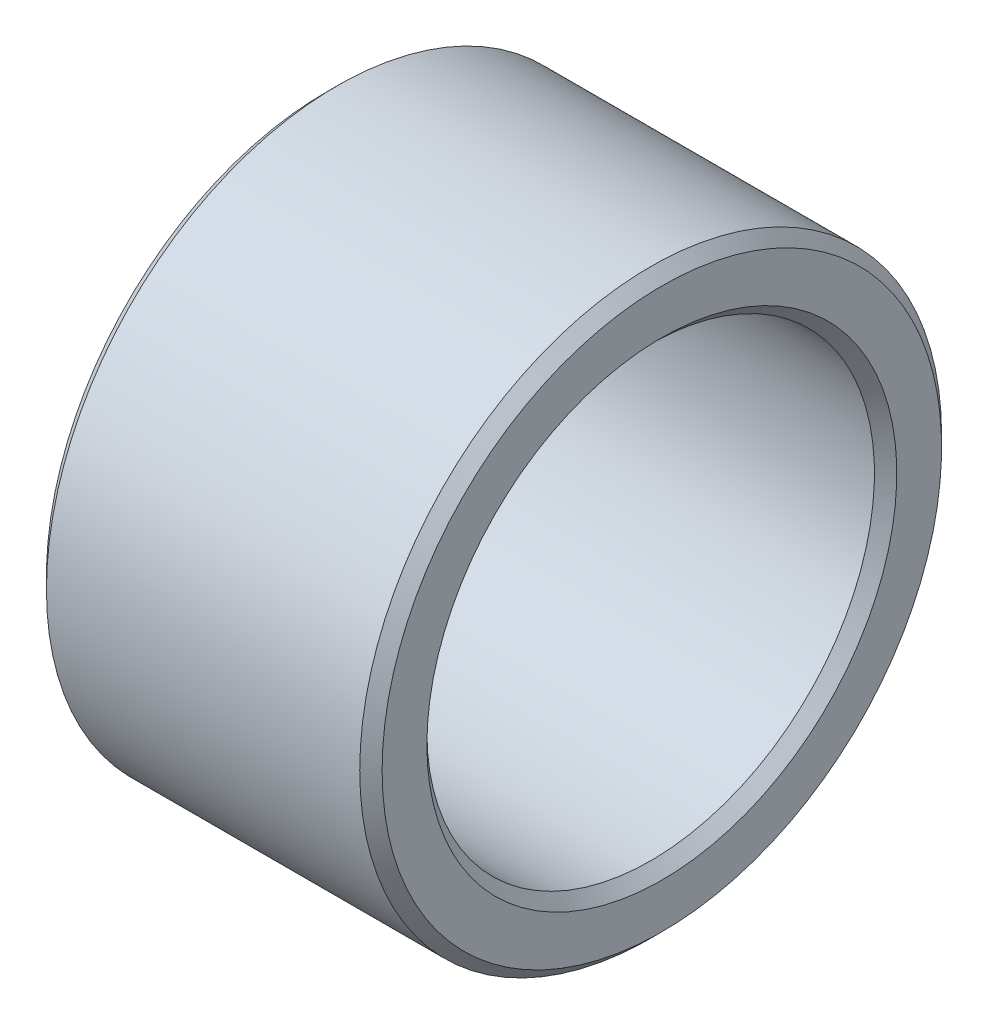
ISO-10303-21;
HEADER;
FILE_DESCRIPTION(('STEP AP214'),'2;1');
FILE_NAME('part.step','',(''),(''),'','','');
FILE_SCHEMA(('AUTOMOTIVE_DESIGN { 1 0 10303 214 1 1 1 1 }'));
ENDSEC;
DATA;
#1=APPLICATION_CONTEXT('core data for automotive mechanical design processes');
#2=APPLICATION_PROTOCOL_DEFINITION('international standard','automotive_design',2000,#1);
#3=PRODUCT_CONTEXT('',#1,'mechanical');
#4=PRODUCT('Part','Part','',(#3));
#5=PRODUCT_RELATED_PRODUCT_CATEGORY('part','',(#4));
#6=PRODUCT_DEFINITION_FORMATION('','',#4);
#7=PRODUCT_DEFINITION_CONTEXT('part definition',#1,'design');
#8=PRODUCT_DEFINITION('design','',#6,#7);
#9=PRODUCT_DEFINITION_SHAPE('','',#8);
#10=(LENGTH_UNIT() NAMED_UNIT(*) SI_UNIT(.MILLI.,.METRE.));
#11=(NAMED_UNIT(*) PLANE_ANGLE_UNIT() SI_UNIT($,.RADIAN.));
#12=(NAMED_UNIT(*) SI_UNIT($,.STERADIAN.) SOLID_ANGLE_UNIT());
#13=UNCERTAINTY_MEASURE_WITH_UNIT(LENGTH_MEASURE(1.E-05),#10,'distance_accuracy_value','');
#14=(GEOMETRIC_REPRESENTATION_CONTEXT(3) GLOBAL_UNCERTAINTY_ASSIGNED_CONTEXT((#13)) GLOBAL_UNIT_ASSIGNED_CONTEXT((#10,
#11,#12)) REPRESENTATION_CONTEXT('',''));
#15=CARTESIAN_POINT('',(0.,0.,0.));
#16=DIRECTION('',(0.,0.,1.));
#17=DIRECTION('',(1.,0.,0.));
#18=AXIS2_PLACEMENT_3D('',#15,#16,#17);
#19=CARTESIAN_POINT('',(0.,10.,0.));
#20=DIRECTION('',(1.,0.,0.));
#21=DIRECTION('',(0.,0.,-1.));
#22=AXIS2_PLACEMENT_3D('',#19,#20,#21);
#23=PLANE('',#22);
#24=CARTESIAN_POINT('',(0.,0.,0.));
#25=DIRECTION('',(1.,0.,0.));
#26=DIRECTION('',(0.,0.,-1.));
#27=AXIS2_PLACEMENT_3D('',#24,#25,#26);
#28=CIRCLE('',#27,10.5);
#29=CARTESIAN_POINT('',(0.,0.,-10.5));
#30=VERTEX_POINT('',#29);
#31=EDGE_CURVE('E46',#30,#30,#28,.T.);
#32=ORIENTED_EDGE('',*,*,#31,.T.);
#33=EDGE_LOOP('',(#32));
#34=FACE_BOUND('',#33,.T.);
#35=CARTESIAN_POINT('',(0.,0.,0.));
#36=DIRECTION('',(1.,0.,0.));
#37=DIRECTION('',(0.,0.,-1.));
#38=AXIS2_PLACEMENT_3D('',#35,#36,#37);
#39=CIRCLE('',#38,12.5);
#40=CARTESIAN_POINT('',(0.,0.,-12.5));
#41=VERTEX_POINT('',#40);
#42=EDGE_CURVE('E49',#41,#41,#39,.F.);
#43=ORIENTED_EDGE('',*,*,#42,.T.);
#44=EDGE_LOOP('',(#43));
#45=FACE_BOUND('',#44,.T.);
#46=ADVANCED_FACE('F27',(#34,#45),#23,.F.);
#47=CARTESIAN_POINT('',(0.,0.,0.));
#48=DIRECTION('',(-1.,0.,0.));
#49=DIRECTION('',(0.,0.,1.));
#50=AXIS2_PLACEMENT_3D('',#47,#48,#49);
#51=CYLINDRICAL_SURFACE('',#50,13.);
#52=CARTESIAN_POINT('',(0.500000000000002,0.,0.));
#53=DIRECTION('',(1.,0.,0.));
#54=DIRECTION('',(0.,0.,-1.));
#55=AXIS2_PLACEMENT_3D('',#52,#53,#54);
#56=CIRCLE('',#55,13.);
#57=CARTESIAN_POINT('',(0.500000000000002,0.,-13.));
#58=VERTEX_POINT('',#57);
#59=EDGE_CURVE('E10',#58,#58,#56,.T.);
#60=ORIENTED_EDGE('',*,*,#59,.T.);
#61=EDGE_LOOP('',(#60));
#62=FACE_BOUND('',#61,.T.);
#63=CARTESIAN_POINT('',(14.5,0.,0.));
#64=DIRECTION('',(-1.,0.,0.));
#65=DIRECTION('',(0.,0.,1.));
#66=AXIS2_PLACEMENT_3D('',#63,#64,#65);
#67=CIRCLE('',#66,13.);
#68=CARTESIAN_POINT('',(14.5,0.,13.));
#69=VERTEX_POINT('',#68);
#70=EDGE_CURVE('E33',#69,#69,#67,.T.);
#71=ORIENTED_EDGE('',*,*,#70,.T.);
#72=EDGE_LOOP('',(#71));
#73=FACE_BOUND('',#72,.T.);
#74=ADVANCED_FACE('F72',(#62,#73),#51,.T.);
#75=CARTESIAN_POINT('',(15.,13.,0.));
#76=DIRECTION('',(-1.,0.,0.));
#77=DIRECTION('',(0.,0.,1.));
#78=AXIS2_PLACEMENT_3D('',#75,#76,#77);
#79=PLANE('',#78);
#80=CARTESIAN_POINT('',(15.,0.,0.));
#81=DIRECTION('',(-1.,0.,0.));
#82=DIRECTION('',(0.,0.,1.));
#83=AXIS2_PLACEMENT_3D('',#80,#81,#82);
#84=CIRCLE('',#83,10.5);
#85=CARTESIAN_POINT('',(15.,0.,10.5));
#86=VERTEX_POINT('',#85);
#87=EDGE_CURVE('E37',#86,#86,#84,.T.);
#88=ORIENTED_EDGE('',*,*,#87,.T.);
#89=EDGE_LOOP('',(#88));
#90=FACE_BOUND('',#89,.T.);
#91=CARTESIAN_POINT('',(15.,0.,0.));
#92=DIRECTION('',(-1.,0.,0.));
#93=DIRECTION('',(0.,0.,1.));
#94=AXIS2_PLACEMENT_3D('',#91,#92,#93);
#95=CIRCLE('',#94,12.5);
#96=CARTESIAN_POINT('',(15.,0.,12.5));
#97=VERTEX_POINT('',#96);
#98=EDGE_CURVE('E41',#97,#97,#95,.F.);
#99=ORIENTED_EDGE('',*,*,#98,.T.);
#100=EDGE_LOOP('',(#99));
#101=FACE_BOUND('',#100,.T.);
#102=ADVANCED_FACE('F69',(#90,#101),#79,.F.);
#103=CARTESIAN_POINT('',(0.,0.,0.));
#104=DIRECTION('',(-1.,0.,0.));
#105=DIRECTION('',(0.,0.,1.));
#106=AXIS2_PLACEMENT_3D('',#103,#104,#105);
#107=CYLINDRICAL_SURFACE('',#106,10.);
#108=CARTESIAN_POINT('',(0.500000000000006,0.,0.));
#109=DIRECTION('',(1.,0.,0.));
#110=DIRECTION('',(0.,0.,-1.));
#111=AXIS2_PLACEMENT_3D('',#108,#109,#110);
#112=CIRCLE('',#111,10.);
#113=CARTESIAN_POINT('',(0.500000000000006,0.,-10.));
#114=VERTEX_POINT('',#113);
#115=EDGE_CURVE('E52',#114,#114,#112,.F.);
#116=ORIENTED_EDGE('',*,*,#115,.T.);
#117=EDGE_LOOP('',(#116));
#118=FACE_BOUND('',#117,.T.);
#119=CARTESIAN_POINT('',(14.5,0.,0.));
#120=DIRECTION('',(-1.,0.,0.));
#121=DIRECTION('',(0.,0.,1.));
#122=AXIS2_PLACEMENT_3D('',#119,#120,#121);
#123=CIRCLE('',#122,10.);
#124=CARTESIAN_POINT('',(14.5,0.,10.));
#125=VERTEX_POINT('',#124);
#126=EDGE_CURVE('E55',#125,#125,#123,.F.);
#127=ORIENTED_EDGE('',*,*,#126,.T.);
#128=EDGE_LOOP('',(#127));
#129=FACE_BOUND('',#128,.T.);
#130=ADVANCED_FACE('F59',(#118,#129),#107,.F.);
#131=CARTESIAN_POINT('',(0.500000000000006,0.,0.));
#132=DIRECTION('',(-1.,0.,0.));
#133=DIRECTION('',(0.,0.,1.));
#134=AXIS2_PLACEMENT_3D('',#131,#132,#133);
#135=CONICAL_SURFACE('',#134,10.,0.785398163397447);
#136=ORIENTED_EDGE('',*,*,#31,.F.);
#137=EDGE_LOOP('',(#136));
#138=FACE_BOUND('',#137,.T.);
#139=ORIENTED_EDGE('',*,*,#115,.F.);
#140=EDGE_LOOP('',(#139));
#141=FACE_BOUND('',#140,.T.);
#142=ADVANCED_FACE('F65',(#138,#141),#135,.F.);
#143=CARTESIAN_POINT('',(15.,0.,0.));
#144=DIRECTION('',(1.,0.,0.));
#145=DIRECTION('',(0.,0.,-1.));
#146=AXIS2_PLACEMENT_3D('',#143,#144,#145);
#147=CONICAL_SURFACE('',#146,10.5,0.785398163397447);
#148=ORIENTED_EDGE('',*,*,#126,.F.);
#149=EDGE_LOOP('',(#148));
#150=FACE_BOUND('',#149,.T.);
#151=ORIENTED_EDGE('',*,*,#87,.F.);
#152=EDGE_LOOP('',(#151));
#153=FACE_BOUND('',#152,.T.);
#154=ADVANCED_FACE('F61',(#150,#153),#147,.F.);
#155=CARTESIAN_POINT('',(0.,0.,0.));
#156=DIRECTION('',(1.,0.,0.));
#157=DIRECTION('',(0.,0.,-1.));
#158=AXIS2_PLACEMENT_3D('',#155,#156,#157);
#159=CONICAL_SURFACE('',#158,12.5,0.785398163397445);
#160=ORIENTED_EDGE('',*,*,#59,.F.);
#161=EDGE_LOOP('',(#160));
#162=FACE_BOUND('',#161,.T.);
#163=ORIENTED_EDGE('',*,*,#42,.F.);
#164=EDGE_LOOP('',(#163));
#165=FACE_BOUND('',#164,.T.);
#166=ADVANCED_FACE('F64',(#162,#165),#159,.T.);
#167=CARTESIAN_POINT('',(14.5,0.,0.));
#168=DIRECTION('',(-1.,0.,0.));
#169=DIRECTION('',(0.,0.,1.));
#170=AXIS2_PLACEMENT_3D('',#167,#168,#169);
#171=CONICAL_SURFACE('',#170,13.,0.785398163397452);
#172=ORIENTED_EDGE('',*,*,#98,.F.);
#173=EDGE_LOOP('',(#172));
#174=FACE_BOUND('',#173,.T.);
#175=ORIENTED_EDGE('',*,*,#70,.F.);
#176=EDGE_LOOP('',(#175));
#177=FACE_BOUND('',#176,.T.);
#178=ADVANCED_FACE('F76',(#174,#177),#171,.T.);
#179=CLOSED_SHELL('',(#46,#74,#102,#130,#142,#154,#166,#178));
#180=MANIFOLD_SOLID_BREP('B2',#179);
#181=ADVANCED_BREP_SHAPE_REPRESENTATION('',(#18,#180),#14);
#182=SHAPE_DEFINITION_REPRESENTATION(#9,#181);
ENDSEC;
END-ISO-10303-21;
